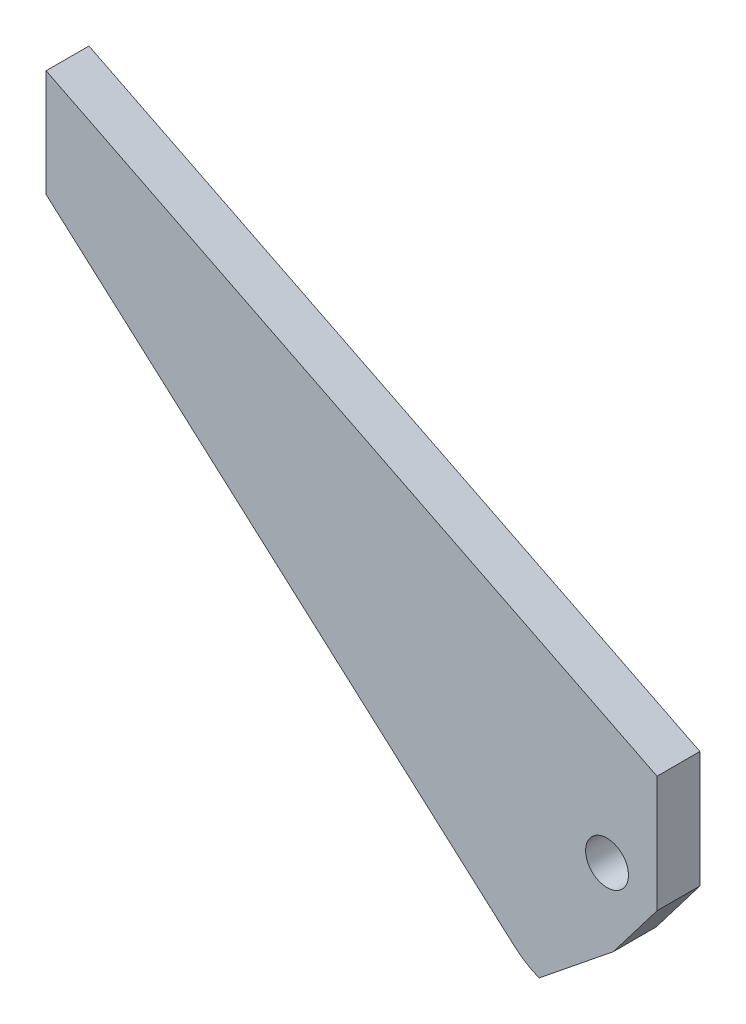
ISO-10303-21;
HEADER;
FILE_DESCRIPTION(('STEP AP214'),'2;1');
FILE_NAME('part.step','',(''),(''),'','','');
FILE_SCHEMA(('AUTOMOTIVE_DESIGN { 1 0 10303 214 1 1 1 1 }'));
ENDSEC;
DATA;
#1=APPLICATION_CONTEXT('core data for automotive mechanical design processes');
#2=APPLICATION_PROTOCOL_DEFINITION('international standard','automotive_design',2000,#1);
#3=PRODUCT_CONTEXT('',#1,'mechanical');
#4=PRODUCT('Part','Part','',(#3));
#5=PRODUCT_RELATED_PRODUCT_CATEGORY('part','',(#4));
#6=PRODUCT_DEFINITION_FORMATION('','',#4);
#7=PRODUCT_DEFINITION_CONTEXT('part definition',#1,'design');
#8=PRODUCT_DEFINITION('design','',#6,#7);
#9=PRODUCT_DEFINITION_SHAPE('','',#8);
#10=(LENGTH_UNIT() NAMED_UNIT(*) SI_UNIT(.MILLI.,.METRE.));
#11=(NAMED_UNIT(*) PLANE_ANGLE_UNIT() SI_UNIT($,.RADIAN.));
#12=(NAMED_UNIT(*) SI_UNIT($,.STERADIAN.) SOLID_ANGLE_UNIT());
#13=UNCERTAINTY_MEASURE_WITH_UNIT(LENGTH_MEASURE(1.E-05),#10,'distance_accuracy_value','');
#14=(GEOMETRIC_REPRESENTATION_CONTEXT(3) GLOBAL_UNCERTAINTY_ASSIGNED_CONTEXT((#13)) GLOBAL_UNIT_ASSIGNED_CONTEXT((#10,
#11,#12)) REPRESENTATION_CONTEXT('',''));
#15=CARTESIAN_POINT('',(0.,0.,0.));
#16=DIRECTION('',(0.,0.,1.));
#17=DIRECTION('',(1.,0.,0.));
#18=AXIS2_PLACEMENT_3D('',#15,#16,#17);
#19=CARTESIAN_POINT('',(-4.,4.20163391116485,3.));
#20=DIRECTION('',(0.,0.,1.));
#21=DIRECTION('',(1.,0.,0.));
#22=AXIS2_PLACEMENT_3D('',#19,#20,#21);
#23=PLANE('',#22);
#24=DIRECTION('',(-0.778331607733783,-0.627853413148758,0.));
#25=VECTOR('',#24,1.);
#26=CARTESIAN_POINT('',(-1.06166745577241,2.83241546437071,3.));
#27=LINE('',#26,#25);
#28=CARTESIAN_POINT('',(-1.06166745577241,2.83241546437071,3.));
#29=VERTEX_POINT('',#28);
#30=CARTESIAN_POINT('',(-6.25633783792409,-1.3579469688253,3.));
#31=VERTEX_POINT('',#30);
#32=EDGE_CURVE('E133',#29,#31,#27,.T.);
#33=ORIENTED_EDGE('',*,*,#32,.F.);
#34=DIRECTION('',(-0.606561241419716,-0.795036766701624,0.));
#35=VECTOR('',#34,1.);
#36=CARTESIAN_POINT('',(-1.06166745577241,2.83241546437071,3.));
#37=LINE('',#36,#35);
#38=CARTESIAN_POINT('',(2.,6.84542854291088,3.));
#39=VERTEX_POINT('',#38);
#40=EDGE_CURVE('E112',#39,#29,#37,.T.);
#41=ORIENTED_EDGE('',*,*,#40,.F.);
#42=DIRECTION('',(0.,1.,0.));
#43=VECTOR('',#42,1.);
#44=CARTESIAN_POINT('',(2.,15.,3.));
#45=LINE('',#44,#43);
#46=CARTESIAN_POINT('',(2.,15.,3.));
#47=VERTEX_POINT('',#46);
#48=EDGE_CURVE('E94',#39,#47,#45,.T.);
#49=ORIENTED_EDGE('',*,*,#48,.T.);
#50=DIRECTION('',(-0.894427190999916,0.447213595499958,0.));
#51=VECTOR('',#50,1.);
#52=CARTESIAN_POINT('',(2.,15.,3.));
#53=LINE('',#52,#51);
#54=CARTESIAN_POINT('',(-40.7549414746294,36.3774707373147,3.));
#55=VERTEX_POINT('',#54);
#56=EDGE_CURVE('E155',#47,#55,#53,.T.);
#57=ORIENTED_EDGE('',*,*,#56,.T.);
#58=DIRECTION('',(0.,-1.,0.));
#59=VECTOR('',#58,1.);
#60=CARTESIAN_POINT('',(-40.7549414746294,28.8774707373147,3.));
#61=LINE('',#60,#59);
#62=CARTESIAN_POINT('',(-40.7549414746294,28.8774707373147,3.));
#63=VERTEX_POINT('',#62);
#64=EDGE_CURVE('E158',#55,#63,#61,.T.);
#65=ORIENTED_EDGE('',*,*,#64,.T.);
#66=DIRECTION('',(0.747041203430395,-0.664777737576452,0.));
#67=VECTOR('',#66,1.);
#68=CARTESIAN_POINT('',(-16.7549414746294,7.52032788017186,3.));
#69=LINE('',#68,#67);
#70=CARTESIAN_POINT('',(-7.98866642545872,-0.28061330941753,3.));
#71=VERTEX_POINT('',#70);
#72=EDGE_CURVE('E67',#63,#71,#69,.T.);
#73=ORIENTED_EDGE('',*,*,#72,.T.);
#74=CARTESIAN_POINT('',(-4.,4.20163391116485,3.));
#75=DIRECTION('',(0.,0.,1.));
#76=DIRECTION('',(1.,0.,0.));
#77=AXIS2_PLACEMENT_3D('',#74,#75,#76);
#78=CIRCLE('',#77,6.);
#79=EDGE_CURVE('E150',#71,#31,#78,.T.);
#80=ORIENTED_EDGE('',*,*,#79,.T.);
#81=EDGE_LOOP('',(#33,#41,#49,#57,#65,#73,#80));
#82=FACE_BOUND('',#81,.T.);
#83=CARTESIAN_POINT('',(-1.5,8.,3.));
#84=DIRECTION('',(0.,0.,1.));
#85=DIRECTION('',(1.,0.,0.));
#86=AXIS2_PLACEMENT_3D('',#83,#84,#85);
#87=CIRCLE('',#86,1.5);
#88=CARTESIAN_POINT('',(0.,8.,3.));
#89=VERTEX_POINT('',#88);
#90=EDGE_CURVE('E142',#89,#89,#87,.T.);
#91=ORIENTED_EDGE('',*,*,#90,.F.);
#92=EDGE_LOOP('',(#91));
#93=FACE_BOUND('',#92,.T.);
#94=ADVANCED_FACE('F42',(#82,#93),#23,.T.);
#95=CARTESIAN_POINT('',(-4.,4.20163391116485,0.));
#96=DIRECTION('',(0.,0.,1.));
#97=DIRECTION('',(1.,0.,0.));
#98=AXIS2_PLACEMENT_3D('',#95,#96,#97);
#99=PLANE('',#98);
#100=DIRECTION('',(-0.606561241419716,-0.795036766701624,0.));
#101=VECTOR('',#100,1.);
#102=CARTESIAN_POINT('',(-1.06166745577241,2.83241546437071,0.));
#103=LINE('',#102,#101);
#104=CARTESIAN_POINT('',(2.,6.84542854291088,0.));
#105=VERTEX_POINT('',#104);
#106=CARTESIAN_POINT('',(-1.06166745577241,2.83241546437071,0.));
#107=VERTEX_POINT('',#106);
#108=EDGE_CURVE('E58',#105,#107,#103,.T.);
#109=ORIENTED_EDGE('',*,*,#108,.T.);
#110=DIRECTION('',(-0.778331607733783,-0.627853413148758,0.));
#111=VECTOR('',#110,1.);
#112=CARTESIAN_POINT('',(-1.06166745577241,2.83241546437071,0.));
#113=LINE('',#112,#111);
#114=CARTESIAN_POINT('',(-6.25633783792409,-1.3579469688253,0.));
#115=VERTEX_POINT('',#114);
#116=EDGE_CURVE('E120',#107,#115,#113,.T.);
#117=ORIENTED_EDGE('',*,*,#116,.T.);
#118=CARTESIAN_POINT('',(-4.,4.20163391116485,0.));
#119=DIRECTION('',(0.,0.,1.));
#120=DIRECTION('',(1.,0.,0.));
#121=AXIS2_PLACEMENT_3D('',#118,#119,#120);
#122=CIRCLE('',#121,6.);
#123=CARTESIAN_POINT('',(-7.98866642545872,-0.28061330941753,0.));
#124=VERTEX_POINT('',#123);
#125=EDGE_CURVE('E146',#124,#115,#122,.T.);
#126=ORIENTED_EDGE('',*,*,#125,.F.);
#127=DIRECTION('',(0.747041203430395,-0.664777737576453,0.));
#128=VECTOR('',#127,1.);
#129=CARTESIAN_POINT('',(-16.7549414746294,7.52032788017186,0.));
#130=LINE('',#129,#128);
#131=CARTESIAN_POINT('',(-40.7549414746294,28.8774707373147,0.));
#132=VERTEX_POINT('',#131);
#133=EDGE_CURVE('E87',#132,#124,#130,.T.);
#134=ORIENTED_EDGE('',*,*,#133,.F.);
#135=DIRECTION('',(0.,-1.,0.));
#136=VECTOR('',#135,1.);
#137=CARTESIAN_POINT('',(-40.7549414746294,28.8774707373147,0.));
#138=LINE('',#137,#136);
#139=CARTESIAN_POINT('',(-40.7549414746294,36.3774707373147,0.));
#140=VERTEX_POINT('',#139);
#141=EDGE_CURVE('E171',#140,#132,#138,.T.);
#142=ORIENTED_EDGE('',*,*,#141,.F.);
#143=DIRECTION('',(-0.894427190999916,0.447213595499958,0.));
#144=VECTOR('',#143,1.);
#145=CARTESIAN_POINT('',(2.,15.,0.));
#146=LINE('',#145,#144);
#147=CARTESIAN_POINT('',(2.,15.,0.));
#148=VERTEX_POINT('',#147);
#149=EDGE_CURVE('E168',#148,#140,#146,.T.);
#150=ORIENTED_EDGE('',*,*,#149,.F.);
#151=DIRECTION('',(0.,1.,0.));
#152=VECTOR('',#151,1.);
#153=CARTESIAN_POINT('',(2.,15.,0.));
#154=LINE('',#153,#152);
#155=EDGE_CURVE('E131',#105,#148,#154,.T.);
#156=ORIENTED_EDGE('',*,*,#155,.F.);
#157=EDGE_LOOP('',(#109,#117,#126,#134,#142,#150,#156));
#158=FACE_BOUND('',#157,.T.);
#159=CARTESIAN_POINT('',(-1.5,8.,0.));
#160=DIRECTION('',(0.,0.,1.));
#161=DIRECTION('',(1.,0.,0.));
#162=AXIS2_PLACEMENT_3D('',#159,#160,#161);
#163=CIRCLE('',#162,1.5);
#164=CARTESIAN_POINT('',(0.,8.,0.));
#165=VERTEX_POINT('',#164);
#166=EDGE_CURVE('E116',#165,#165,#163,.T.);
#167=ORIENTED_EDGE('',*,*,#166,.T.);
#168=EDGE_LOOP('',(#167));
#169=FACE_BOUND('',#168,.T.);
#170=ADVANCED_FACE('F128',(#158,#169),#99,.F.);
#171=CARTESIAN_POINT('',(-4.,4.20163391116485,3.));
#172=DIRECTION('',(0.,0.,-1.));
#173=DIRECTION('',(-1.,0.,0.));
#174=AXIS2_PLACEMENT_3D('',#171,#172,#173);
#175=CYLINDRICAL_SURFACE('',#174,6.);
#176=ORIENTED_EDGE('',*,*,#125,.T.);
#177=DIRECTION('',(0.,0.,-1.));
#178=VECTOR('',#177,1.);
#179=CARTESIAN_POINT('',(-6.25633783792409,-1.3579469688253,3.));
#180=LINE('',#179,#178);
#181=EDGE_CURVE('E11',#115,#31,#180,.F.);
#182=ORIENTED_EDGE('',*,*,#181,.T.);
#183=ORIENTED_EDGE('',*,*,#79,.F.);
#184=DIRECTION('',(0.,0.,-1.));
#185=VECTOR('',#184,1.);
#186=CARTESIAN_POINT('',(-7.98866642545872,-0.28061330941753,3.));
#187=LINE('',#186,#185);
#188=EDGE_CURVE('E163',#71,#124,#187,.T.);
#189=ORIENTED_EDGE('',*,*,#188,.T.);
#190=EDGE_LOOP('',(#176,#182,#183,#189));
#191=FACE_BOUND('',#190,.T.);
#192=ADVANCED_FACE('F44',(#191),#175,.T.);
#193=CARTESIAN_POINT('',(2.,15.,3.));
#194=DIRECTION('',(-1.,0.,0.));
#195=DIRECTION('',(0.,-1.,0.));
#196=AXIS2_PLACEMENT_3D('',#193,#194,#195);
#197=PLANE('',#196);
#198=ORIENTED_EDGE('',*,*,#48,.F.);
#199=DIRECTION('',(0.,0.,1.));
#200=VECTOR('',#199,1.);
#201=CARTESIAN_POINT('',(2.,6.84542854291088,0.));
#202=LINE('',#201,#200);
#203=EDGE_CURVE('E117',#105,#39,#202,.T.);
#204=ORIENTED_EDGE('',*,*,#203,.F.);
#205=ORIENTED_EDGE('',*,*,#155,.T.);
#206=DIRECTION('',(0.,0.,-1.));
#207=VECTOR('',#206,1.);
#208=CARTESIAN_POINT('',(2.,15.,3.));
#209=LINE('',#208,#207);
#210=EDGE_CURVE('E51',#47,#148,#209,.T.);
#211=ORIENTED_EDGE('',*,*,#210,.F.);
#212=EDGE_LOOP('',(#198,#204,#205,#211));
#213=FACE_BOUND('',#212,.T.);
#214=ADVANCED_FACE('F201',(#213),#197,.F.);
#215=CARTESIAN_POINT('',(2.,15.,3.));
#216=DIRECTION('',(-0.447213595499958,-0.894427190999916,0.));
#217=DIRECTION('',(0.894427190999916,-0.447213595499958,0.));
#218=AXIS2_PLACEMENT_3D('',#215,#216,#217);
#219=PLANE('',#218);
#220=ORIENTED_EDGE('',*,*,#149,.T.);
#221=DIRECTION('',(0.,0.,-1.));
#222=VECTOR('',#221,1.);
#223=CARTESIAN_POINT('',(-40.7549414746294,36.3774707373147,3.));
#224=LINE('',#223,#222);
#225=EDGE_CURVE('E182',#55,#140,#224,.T.);
#226=ORIENTED_EDGE('',*,*,#225,.F.);
#227=ORIENTED_EDGE('',*,*,#56,.F.);
#228=ORIENTED_EDGE('',*,*,#210,.T.);
#229=EDGE_LOOP('',(#220,#226,#227,#228));
#230=FACE_BOUND('',#229,.T.);
#231=ADVANCED_FACE('F189',(#230),#219,.F.);
#232=CARTESIAN_POINT('',(-40.7549414746294,28.8774707373147,3.));
#233=DIRECTION('',(1.,0.,0.));
#234=DIRECTION('',(0.,1.,0.));
#235=AXIS2_PLACEMENT_3D('',#232,#233,#234);
#236=PLANE('',#235);
#237=ORIENTED_EDGE('',*,*,#141,.T.);
#238=DIRECTION('',(0.,0.,-1.));
#239=VECTOR('',#238,1.);
#240=CARTESIAN_POINT('',(-40.7549414746294,28.8774707373147,3.));
#241=LINE('',#240,#239);
#242=EDGE_CURVE('E179',#63,#132,#241,.T.);
#243=ORIENTED_EDGE('',*,*,#242,.F.);
#244=ORIENTED_EDGE('',*,*,#64,.F.);
#245=ORIENTED_EDGE('',*,*,#225,.T.);
#246=EDGE_LOOP('',(#237,#243,#244,#245));
#247=FACE_BOUND('',#246,.T.);
#248=ADVANCED_FACE('F195',(#247),#236,.F.);
#249=CARTESIAN_POINT('',(-16.7549414746294,7.52032788017186,3.));
#250=DIRECTION('',(0.664777737576452,0.747041203430395,0.));
#251=DIRECTION('',(-0.747041203430395,0.664777737576453,0.));
#252=AXIS2_PLACEMENT_3D('',#249,#250,#251);
#253=PLANE('',#252);
#254=ORIENTED_EDGE('',*,*,#133,.T.);
#255=ORIENTED_EDGE('',*,*,#188,.F.);
#256=ORIENTED_EDGE('',*,*,#72,.F.);
#257=ORIENTED_EDGE('',*,*,#242,.T.);
#258=EDGE_LOOP('',(#254,#255,#256,#257));
#259=FACE_BOUND('',#258,.T.);
#260=ADVANCED_FACE('F197',(#259),#253,.F.);
#261=CARTESIAN_POINT('',(-1.5,8.,3.));
#262=DIRECTION('',(0.,0.,-1.));
#263=DIRECTION('',(-1.,0.,0.));
#264=AXIS2_PLACEMENT_3D('',#261,#262,#263);
#265=CYLINDRICAL_SURFACE('',#264,1.5);
#266=ORIENTED_EDGE('',*,*,#90,.T.);
#267=EDGE_LOOP('',(#266));
#268=FACE_BOUND('',#267,.T.);
#269=ORIENTED_EDGE('',*,*,#166,.F.);
#270=EDGE_LOOP('',(#269));
#271=FACE_BOUND('',#270,.T.);
#272=ADVANCED_FACE('F217',(#268,#271),#265,.F.);
#273=CARTESIAN_POINT('',(-1.06166745577241,2.83241546437071,0.));
#274=DIRECTION('',(-0.627853413148758,0.778331607733783,0.));
#275=DIRECTION('',(-0.778331607733783,-0.627853413148758,0.));
#276=AXIS2_PLACEMENT_3D('',#273,#274,#275);
#277=PLANE('',#276);
#278=ORIENTED_EDGE('',*,*,#116,.F.);
#279=DIRECTION('',(0.,0.,1.));
#280=VECTOR('',#279,1.);
#281=CARTESIAN_POINT('',(-1.06166745577241,2.83241546437071,0.));
#282=LINE('',#281,#280);
#283=EDGE_CURVE('E109',#107,#29,#282,.T.);
#284=ORIENTED_EDGE('',*,*,#283,.T.);
#285=ORIENTED_EDGE('',*,*,#32,.T.);
#286=ORIENTED_EDGE('',*,*,#181,.F.);
#287=EDGE_LOOP('',(#278,#284,#285,#286));
#288=FACE_BOUND('',#287,.T.);
#289=ADVANCED_FACE('F121',(#288),#277,.F.);
#290=CARTESIAN_POINT('',(-1.06166745577241,2.83241546437071,0.));
#291=DIRECTION('',(-0.795036766701624,0.606561241419716,0.));
#292=DIRECTION('',(-0.606561241419716,-0.795036766701624,0.));
#293=AXIS2_PLACEMENT_3D('',#290,#291,#292);
#294=PLANE('',#293);
#295=ORIENTED_EDGE('',*,*,#40,.T.);
#296=ORIENTED_EDGE('',*,*,#283,.F.);
#297=ORIENTED_EDGE('',*,*,#108,.F.);
#298=ORIENTED_EDGE('',*,*,#203,.T.);
#299=EDGE_LOOP('',(#295,#296,#297,#298));
#300=FACE_BOUND('',#299,.T.);
#301=ADVANCED_FACE('F111',(#300),#294,.F.);
#302=CLOSED_SHELL('',(#94,#170,#192,#214,#231,#248,#260,#272,#289,#301));
#303=MANIFOLD_SOLID_BREP('B2',#302);
#304=ADVANCED_BREP_SHAPE_REPRESENTATION('',(#18,#303),#14);
#305=SHAPE_DEFINITION_REPRESENTATION(#9,#304);
ENDSEC;
END-ISO-10303-21;
